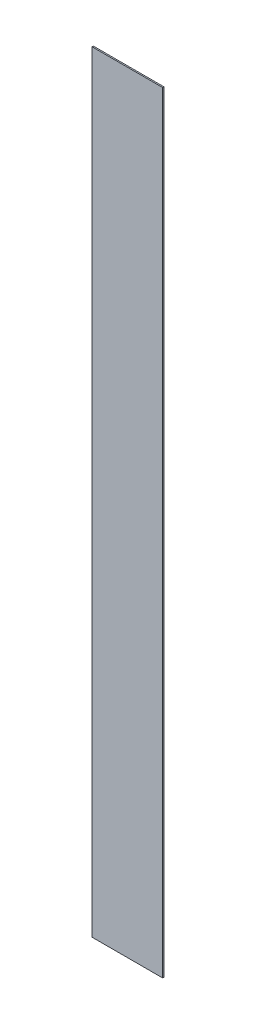
ISO-10303-21;
HEADER;
FILE_DESCRIPTION(('STEP AP214'),'2;1');
FILE_NAME('part.step','',(''),(''),'','','');
FILE_SCHEMA(('AUTOMOTIVE_DESIGN { 1 0 10303 214 1 1 1 1 }'));
ENDSEC;
DATA;
#1=APPLICATION_CONTEXT('core data for automotive mechanical design processes');
#2=APPLICATION_PROTOCOL_DEFINITION('international standard','automotive_design',2000,#1);
#3=PRODUCT_CONTEXT('',#1,'mechanical');
#4=PRODUCT('Part','Part','',(#3));
#5=PRODUCT_RELATED_PRODUCT_CATEGORY('part','',(#4));
#6=PRODUCT_DEFINITION_FORMATION('','',#4);
#7=PRODUCT_DEFINITION_CONTEXT('part definition',#1,'design');
#8=PRODUCT_DEFINITION('design','',#6,#7);
#9=PRODUCT_DEFINITION_SHAPE('','',#8);
#10=(LENGTH_UNIT() NAMED_UNIT(*) SI_UNIT(.MILLI.,.METRE.));
#11=(NAMED_UNIT(*) PLANE_ANGLE_UNIT() SI_UNIT($,.RADIAN.));
#12=(NAMED_UNIT(*) SI_UNIT($,.STERADIAN.) SOLID_ANGLE_UNIT());
#13=UNCERTAINTY_MEASURE_WITH_UNIT(LENGTH_MEASURE(1.E-05),#10,'distance_accuracy_value','');
#14=(GEOMETRIC_REPRESENTATION_CONTEXT(3) GLOBAL_UNCERTAINTY_ASSIGNED_CONTEXT((#13)) GLOBAL_UNIT_ASSIGNED_CONTEXT((#10,
#11,#12)) REPRESENTATION_CONTEXT('',''));
#15=CARTESIAN_POINT('',(0.,0.,0.));
#16=DIRECTION('',(0.,0.,1.));
#17=DIRECTION('',(1.,0.,0.));
#18=AXIS2_PLACEMENT_3D('',#15,#16,#17);
#19=CARTESIAN_POINT('',(497.5,300.,-20.));
#20=DIRECTION('',(-1.,0.,0.));
#21=DIRECTION('',(0.,0.,1.));
#22=AXIS2_PLACEMENT_3D('',#19,#20,#21);
#23=PLANE('',#22);
#24=DIRECTION('',(0.,-1.,0.));
#25=VECTOR('',#24,1.);
#26=CARTESIAN_POINT('',(497.5,300.,-18.));
#27=LINE('',#26,#25);
#28=CARTESIAN_POINT('',(497.5,1500.,-18.));
#29=VERTEX_POINT('',#28);
#30=CARTESIAN_POINT('',(497.5,300.,-18.));
#31=VERTEX_POINT('',#30);
#32=EDGE_CURVE('E103',#29,#31,#27,.T.);
#33=ORIENTED_EDGE('',*,*,#32,.F.);
#34=DIRECTION('',(0.,0.,1.));
#35=VECTOR('',#34,1.);
#36=CARTESIAN_POINT('',(497.5,1500.,-20.));
#37=LINE('',#36,#35);
#38=CARTESIAN_POINT('',(497.5,1500.,-20.));
#39=VERTEX_POINT('',#38);
#40=EDGE_CURVE('E11',#39,#29,#37,.T.);
#41=ORIENTED_EDGE('',*,*,#40,.F.);
#42=DIRECTION('',(0.,-1.,0.));
#43=VECTOR('',#42,1.);
#44=CARTESIAN_POINT('',(497.5,300.,-20.));
#45=LINE('',#44,#43);
#46=CARTESIAN_POINT('',(497.5,300.,-20.));
#47=VERTEX_POINT('',#46);
#48=EDGE_CURVE('E97',#39,#47,#45,.T.);
#49=ORIENTED_EDGE('',*,*,#48,.T.);
#50=DIRECTION('',(0.,0.,1.));
#51=VECTOR('',#50,1.);
#52=CARTESIAN_POINT('',(497.5,300.,-20.));
#53=LINE('',#52,#51);
#54=EDGE_CURVE('E42',#47,#31,#53,.T.);
#55=ORIENTED_EDGE('',*,*,#54,.T.);
#56=EDGE_LOOP('',(#33,#41,#49,#55));
#57=FACE_BOUND('',#56,.T.);
#58=ADVANCED_FACE('F39',(#57),#23,.T.);
#59=CARTESIAN_POINT('',(497.5,1500.,-20.));
#60=DIRECTION('',(0.,1.,0.));
#61=DIRECTION('',(0.,0.,1.));
#62=AXIS2_PLACEMENT_3D('',#59,#60,#61);
#63=PLANE('',#62);
#64=DIRECTION('',(-1.,0.,0.));
#65=VECTOR('',#64,1.);
#66=CARTESIAN_POINT('',(497.5,1500.,-18.));
#67=LINE('',#66,#65);
#68=CARTESIAN_POINT('',(607.5,1500.,-18.));
#69=VERTEX_POINT('',#68);
#70=EDGE_CURVE('E99',#69,#29,#67,.T.);
#71=ORIENTED_EDGE('',*,*,#70,.F.);
#72=DIRECTION('',(0.,0.,1.));
#73=VECTOR('',#72,1.);
#74=CARTESIAN_POINT('',(607.5,1500.,-20.));
#75=LINE('',#74,#73);
#76=CARTESIAN_POINT('',(607.5,1500.,-20.));
#77=VERTEX_POINT('',#76);
#78=EDGE_CURVE('E48',#77,#69,#75,.T.);
#79=ORIENTED_EDGE('',*,*,#78,.F.);
#80=DIRECTION('',(-1.,0.,0.));
#81=VECTOR('',#80,1.);
#82=CARTESIAN_POINT('',(497.5,1500.,-20.));
#83=LINE('',#82,#81);
#84=EDGE_CURVE('E94',#77,#39,#83,.T.);
#85=ORIENTED_EDGE('',*,*,#84,.T.);
#86=ORIENTED_EDGE('',*,*,#40,.T.);
#87=EDGE_LOOP('',(#71,#79,#85,#86));
#88=FACE_BOUND('',#87,.T.);
#89=ADVANCED_FACE('F113',(#88),#63,.T.);
#90=CARTESIAN_POINT('',(607.5,300.,-20.));
#91=DIRECTION('',(1.,0.,0.));
#92=DIRECTION('',(0.,0.,-1.));
#93=AXIS2_PLACEMENT_3D('',#90,#91,#92);
#94=PLANE('',#93);
#95=DIRECTION('',(0.,1.,0.));
#96=VECTOR('',#95,1.);
#97=CARTESIAN_POINT('',(607.5,300.,-18.));
#98=LINE('',#97,#96);
#99=CARTESIAN_POINT('',(607.5,300.,-18.));
#100=VERTEX_POINT('',#99);
#101=EDGE_CURVE('E89',#100,#69,#98,.T.);
#102=ORIENTED_EDGE('',*,*,#101,.F.);
#103=DIRECTION('',(0.,0.,1.));
#104=VECTOR('',#103,1.);
#105=CARTESIAN_POINT('',(607.5,300.,-20.));
#106=LINE('',#105,#104);
#107=CARTESIAN_POINT('',(607.5,300.,-20.));
#108=VERTEX_POINT('',#107);
#109=EDGE_CURVE('E84',#108,#100,#106,.T.);
#110=ORIENTED_EDGE('',*,*,#109,.F.);
#111=DIRECTION('',(0.,1.,0.));
#112=VECTOR('',#111,1.);
#113=CARTESIAN_POINT('',(607.5,300.,-20.));
#114=LINE('',#113,#112);
#115=EDGE_CURVE('E87',#108,#77,#114,.T.);
#116=ORIENTED_EDGE('',*,*,#115,.T.);
#117=ORIENTED_EDGE('',*,*,#78,.T.);
#118=EDGE_LOOP('',(#102,#110,#116,#117));
#119=FACE_BOUND('',#118,.T.);
#120=ADVANCED_FACE('F86',(#119),#94,.T.);
#121=CARTESIAN_POINT('',(497.5,300.,-20.));
#122=DIRECTION('',(0.,-1.,0.));
#123=DIRECTION('',(0.,0.,-1.));
#124=AXIS2_PLACEMENT_3D('',#121,#122,#123);
#125=PLANE('',#124);
#126=DIRECTION('',(1.,0.,0.));
#127=VECTOR('',#126,1.);
#128=CARTESIAN_POINT('',(497.5,300.,-18.));
#129=LINE('',#128,#127);
#130=EDGE_CURVE('E106',#31,#100,#129,.T.);
#131=ORIENTED_EDGE('',*,*,#130,.F.);
#132=ORIENTED_EDGE('',*,*,#54,.F.);
#133=DIRECTION('',(1.,0.,0.));
#134=VECTOR('',#133,1.);
#135=CARTESIAN_POINT('',(497.5,300.,-20.));
#136=LINE('',#135,#134);
#137=EDGE_CURVE('E93',#47,#108,#136,.T.);
#138=ORIENTED_EDGE('',*,*,#137,.T.);
#139=ORIENTED_EDGE('',*,*,#109,.T.);
#140=EDGE_LOOP('',(#131,#132,#138,#139));
#141=FACE_BOUND('',#140,.T.);
#142=ADVANCED_FACE('F96',(#141),#125,.T.);
#143=CARTESIAN_POINT('',(0.,0.,-20.));
#144=DIRECTION('',(0.,0.,-1.));
#145=DIRECTION('',(-1.,0.,0.));
#146=AXIS2_PLACEMENT_3D('',#143,#144,#145);
#147=PLANE('',#146);
#148=ORIENTED_EDGE('',*,*,#48,.F.);
#149=ORIENTED_EDGE('',*,*,#84,.F.);
#150=ORIENTED_EDGE('',*,*,#115,.F.);
#151=ORIENTED_EDGE('',*,*,#137,.F.);
#152=EDGE_LOOP('',(#148,#149,#150,#151));
#153=FACE_BOUND('',#152,.T.);
#154=ADVANCED_FACE('F92',(#153),#147,.T.);
#155=CARTESIAN_POINT('',(0.,0.,-18.));
#156=DIRECTION('',(0.,0.,-1.));
#157=DIRECTION('',(-1.,0.,0.));
#158=AXIS2_PLACEMENT_3D('',#155,#156,#157);
#159=PLANE('',#158);
#160=ORIENTED_EDGE('',*,*,#32,.T.);
#161=ORIENTED_EDGE('',*,*,#130,.T.);
#162=ORIENTED_EDGE('',*,*,#101,.T.);
#163=ORIENTED_EDGE('',*,*,#70,.T.);
#164=EDGE_LOOP('',(#160,#161,#162,#163));
#165=FACE_BOUND('',#164,.T.);
#166=ADVANCED_FACE('F112',(#165),#159,.F.);
#167=CLOSED_SHELL('',(#58,#89,#120,#142,#154,#166));
#168=MANIFOLD_SOLID_BREP('B2',#167);
#169=ADVANCED_BREP_SHAPE_REPRESENTATION('',(#18,#168),#14);
#170=SHAPE_DEFINITION_REPRESENTATION(#9,#169);
ENDSEC;
END-ISO-10303-21;
